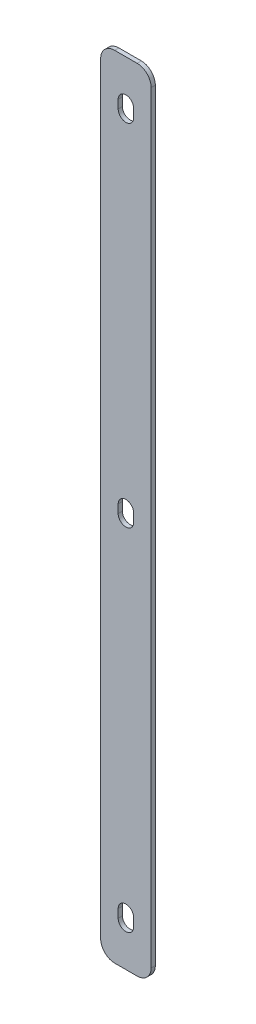
ISO-10303-21;
HEADER;
FILE_DESCRIPTION(('STEP AP214'),'2;1');
FILE_NAME('part.step','',(''),(''),'','','');
FILE_SCHEMA(('AUTOMOTIVE_DESIGN { 1 0 10303 214 1 1 1 1 }'));
ENDSEC;
DATA;
#1=APPLICATION_CONTEXT('core data for automotive mechanical design processes');
#2=APPLICATION_PROTOCOL_DEFINITION('international standard','automotive_design',2000,#1);
#3=PRODUCT_CONTEXT('',#1,'mechanical');
#4=PRODUCT('Part','Part','',(#3));
#5=PRODUCT_RELATED_PRODUCT_CATEGORY('part','',(#4));
#6=PRODUCT_DEFINITION_FORMATION('','',#4);
#7=PRODUCT_DEFINITION_CONTEXT('part definition',#1,'design');
#8=PRODUCT_DEFINITION('design','',#6,#7);
#9=PRODUCT_DEFINITION_SHAPE('','',#8);
#10=(LENGTH_UNIT() NAMED_UNIT(*) SI_UNIT(.MILLI.,.METRE.));
#11=(NAMED_UNIT(*) PLANE_ANGLE_UNIT() SI_UNIT($,.RADIAN.));
#12=(NAMED_UNIT(*) SI_UNIT($,.STERADIAN.) SOLID_ANGLE_UNIT());
#13=UNCERTAINTY_MEASURE_WITH_UNIT(LENGTH_MEASURE(1.E-05),#10,'distance_accuracy_value','');
#14=(GEOMETRIC_REPRESENTATION_CONTEXT(3) GLOBAL_UNCERTAINTY_ASSIGNED_CONTEXT((#13)) GLOBAL_UNIT_ASSIGNED_CONTEXT((#10,
#11,#12)) REPRESENTATION_CONTEXT('',''));
#15=CARTESIAN_POINT('',(0.,0.,0.));
#16=DIRECTION('',(0.,0.,1.));
#17=DIRECTION('',(1.,0.,0.));
#18=AXIS2_PLACEMENT_3D('',#15,#16,#17);
#19=CARTESIAN_POINT('',(0.,0.,-1.5));
#20=DIRECTION('',(0.,0.,1.));
#21=DIRECTION('',(1.,0.,0.));
#22=AXIS2_PLACEMENT_3D('',#19,#20,#21);
#23=PLANE('',#22);
#24=DIRECTION('',(0.,1.,0.));
#25=VECTOR('',#24,1.);
#26=CARTESIAN_POINT('',(2.75,-126.5,-1.5));
#27=LINE('',#26,#25);
#28=CARTESIAN_POINT('',(2.75,-126.5,-1.5));
#29=VERTEX_POINT('',#28);
#30=CARTESIAN_POINT('',(2.75,-123.5,-1.5));
#31=VERTEX_POINT('',#30);
#32=EDGE_CURVE('E184',#29,#31,#27,.T.);
#33=ORIENTED_EDGE('',*,*,#32,.T.);
#34=CARTESIAN_POINT('',(0.,-123.5,-1.5));
#35=DIRECTION('',(0.,0.,1.));
#36=DIRECTION('',(1.,0.,0.));
#37=AXIS2_PLACEMENT_3D('',#34,#35,#36);
#38=CIRCLE('',#37,2.75);
#39=CARTESIAN_POINT('',(-2.75,-123.5,-1.5));
#40=VERTEX_POINT('',#39);
#41=EDGE_CURVE('E187',#31,#40,#38,.T.);
#42=ORIENTED_EDGE('',*,*,#41,.T.);
#43=DIRECTION('',(0.,1.,0.));
#44=VECTOR('',#43,1.);
#45=CARTESIAN_POINT('',(-2.75,-126.5,-1.5));
#46=LINE('',#45,#44);
#47=CARTESIAN_POINT('',(-2.75,-126.5,-1.5));
#48=VERTEX_POINT('',#47);
#49=EDGE_CURVE('E181',#40,#48,#46,.F.);
#50=ORIENTED_EDGE('',*,*,#49,.T.);
#51=CARTESIAN_POINT('',(0.,-126.5,-1.5));
#52=DIRECTION('',(0.,0.,1.));
#53=DIRECTION('',(1.,0.,0.));
#54=AXIS2_PLACEMENT_3D('',#51,#52,#53);
#55=CIRCLE('',#54,2.75);
#56=EDGE_CURVE('E248',#48,#29,#55,.T.);
#57=ORIENTED_EDGE('',*,*,#56,.T.);
#58=EDGE_LOOP('',(#33,#42,#50,#57));
#59=FACE_BOUND('',#58,.T.);
#60=DIRECTION('',(0.,-1.,0.));
#61=VECTOR('',#60,1.);
#62=CARTESIAN_POINT('',(-2.74999999999738,126.5,-1.5));
#63=LINE('',#62,#61);
#64=CARTESIAN_POINT('',(-2.74999999999738,126.5,-1.5));
#65=VERTEX_POINT('',#64);
#66=CARTESIAN_POINT('',(-2.74999999999738,123.5,-1.5));
#67=VERTEX_POINT('',#66);
#68=EDGE_CURVE('E192',#65,#67,#63,.T.);
#69=ORIENTED_EDGE('',*,*,#68,.T.);
#70=CARTESIAN_POINT('',(2.6201161134431E-12,123.5,-1.5));
#71=DIRECTION('',(0.,0.,1.));
#72=DIRECTION('',(1.,0.,0.));
#73=AXIS2_PLACEMENT_3D('',#70,#71,#72);
#74=CIRCLE('',#73,2.75);
#75=CARTESIAN_POINT('',(2.75000000000262,123.5,-1.5));
#76=VERTEX_POINT('',#75);
#77=EDGE_CURVE('E195',#67,#76,#74,.T.);
#78=ORIENTED_EDGE('',*,*,#77,.T.);
#79=DIRECTION('',(0.,1.,0.));
#80=VECTOR('',#79,1.);
#81=CARTESIAN_POINT('',(2.75000000000262,126.5,-1.5));
#82=LINE('',#81,#80);
#83=CARTESIAN_POINT('',(2.75000000000262,126.5,-1.5));
#84=VERTEX_POINT('',#83);
#85=EDGE_CURVE('E188',#76,#84,#82,.T.);
#86=ORIENTED_EDGE('',*,*,#85,.T.);
#87=CARTESIAN_POINT('',(2.61993241642322E-12,126.5,-1.5));
#88=DIRECTION('',(0.,0.,1.));
#89=DIRECTION('',(1.,0.,0.));
#90=AXIS2_PLACEMENT_3D('',#87,#88,#89);
#91=CIRCLE('',#90,2.75);
#92=EDGE_CURVE('E252',#84,#65,#91,.T.);
#93=ORIENTED_EDGE('',*,*,#92,.T.);
#94=EDGE_LOOP('',(#69,#78,#86,#93));
#95=FACE_BOUND('',#94,.T.);
#96=DIRECTION('',(0.,-1.,0.));
#97=VECTOR('',#96,1.);
#98=CARTESIAN_POINT('',(-2.75,1.49999999999997,-1.5));
#99=LINE('',#98,#97);
#100=CARTESIAN_POINT('',(-2.75,1.49999999999997,-1.5));
#101=VERTEX_POINT('',#100);
#102=CARTESIAN_POINT('',(-2.75,-1.49999999999997,-1.5));
#103=VERTEX_POINT('',#102);
#104=EDGE_CURVE('E200',#101,#103,#99,.T.);
#105=ORIENTED_EDGE('',*,*,#104,.T.);
#106=CARTESIAN_POINT('',(0.,-1.49999999999997,-1.5));
#107=DIRECTION('',(0.,0.,1.));
#108=DIRECTION('',(1.,0.,0.));
#109=AXIS2_PLACEMENT_3D('',#106,#107,#108);
#110=CIRCLE('',#109,2.75);
#111=CARTESIAN_POINT('',(2.75,-1.49999999999997,-1.5));
#112=VERTEX_POINT('',#111);
#113=EDGE_CURVE('E203',#103,#112,#110,.T.);
#114=ORIENTED_EDGE('',*,*,#113,.T.);
#115=DIRECTION('',(0.,1.,0.));
#116=VECTOR('',#115,1.);
#117=CARTESIAN_POINT('',(2.75,1.49999999999997,-1.5));
#118=LINE('',#117,#116);
#119=CARTESIAN_POINT('',(2.75,1.49999999999997,-1.5));
#120=VERTEX_POINT('',#119);
#121=EDGE_CURVE('E196',#112,#120,#118,.T.);
#122=ORIENTED_EDGE('',*,*,#121,.T.);
#123=CARTESIAN_POINT('',(0.,1.49999999999997,-1.5));
#124=DIRECTION('',(0.,0.,1.));
#125=DIRECTION('',(1.,0.,0.));
#126=AXIS2_PLACEMENT_3D('',#123,#124,#125);
#127=CIRCLE('',#126,2.75);
#128=EDGE_CURVE('E256',#120,#101,#127,.T.);
#129=ORIENTED_EDGE('',*,*,#128,.T.);
#130=EDGE_LOOP('',(#105,#114,#122,#129));
#131=FACE_BOUND('',#130,.T.);
#132=DIRECTION('',(1.,0.,0.));
#133=VECTOR('',#132,1.);
#134=CARTESIAN_POINT('',(-8.99999999999998,-141.,-1.5));
#135=LINE('',#134,#133);
#136=CARTESIAN_POINT('',(-3.99999999999998,-141.,-1.5));
#137=VERTEX_POINT('',#136);
#138=CARTESIAN_POINT('',(4.00000000000002,-141.,-1.5));
#139=VERTEX_POINT('',#138);
#140=EDGE_CURVE('E165',#137,#139,#135,.T.);
#141=ORIENTED_EDGE('',*,*,#140,.F.);
#142=CARTESIAN_POINT('',(-3.99999999999998,-136.,-1.5));
#143=DIRECTION('',(0.,0.,1.));
#144=DIRECTION('',(1.,0.,0.));
#145=AXIS2_PLACEMENT_3D('',#142,#143,#144);
#146=CIRCLE('',#145,5.);
#147=CARTESIAN_POINT('',(-8.99999999999998,-136.,-1.5));
#148=VERTEX_POINT('',#147);
#149=EDGE_CURVE('E20',#148,#137,#146,.T.);
#150=ORIENTED_EDGE('',*,*,#149,.F.);
#151=DIRECTION('',(0.,-1.,0.));
#152=VECTOR('',#151,1.);
#153=CARTESIAN_POINT('',(-9.00000000000001,141.,-1.5));
#154=LINE('',#153,#152);
#155=CARTESIAN_POINT('',(-9.00000000000001,136.,-1.5));
#156=VERTEX_POINT('',#155);
#157=EDGE_CURVE('E151',#156,#148,#154,.T.);
#158=ORIENTED_EDGE('',*,*,#157,.F.);
#159=CARTESIAN_POINT('',(-4.00000000000001,136.,-1.5));
#160=DIRECTION('',(0.,0.,1.));
#161=DIRECTION('',(1.,0.,0.));
#162=AXIS2_PLACEMENT_3D('',#159,#160,#161);
#163=CIRCLE('',#162,5.);
#164=CARTESIAN_POINT('',(-4.00000000000001,141.,-1.5));
#165=VERTEX_POINT('',#164);
#166=EDGE_CURVE('E261',#165,#156,#163,.T.);
#167=ORIENTED_EDGE('',*,*,#166,.F.);
#168=DIRECTION('',(1.,0.,0.));
#169=VECTOR('',#168,1.);
#170=CARTESIAN_POINT('',(-9.00000000000001,141.,-1.5));
#171=LINE('',#170,#169);
#172=CARTESIAN_POINT('',(3.99999999999998,141.,-1.5));
#173=VERTEX_POINT('',#172);
#174=EDGE_CURVE('E205',#173,#165,#171,.F.);
#175=ORIENTED_EDGE('',*,*,#174,.F.);
#176=CARTESIAN_POINT('',(3.99999999999998,136.,-1.5));
#177=DIRECTION('',(0.,0.,1.));
#178=DIRECTION('',(1.,0.,0.));
#179=AXIS2_PLACEMENT_3D('',#176,#177,#178);
#180=CIRCLE('',#179,5.);
#181=CARTESIAN_POINT('',(8.99999999999998,136.,-1.5));
#182=VERTEX_POINT('',#181);
#183=EDGE_CURVE('E264',#182,#173,#180,.T.);
#184=ORIENTED_EDGE('',*,*,#183,.F.);
#185=DIRECTION('',(0.,1.,0.));
#186=VECTOR('',#185,1.);
#187=CARTESIAN_POINT('',(8.99999999999998,141.,-1.5));
#188=LINE('',#187,#186);
#189=CARTESIAN_POINT('',(9.00000000000002,-136.,-1.5));
#190=VERTEX_POINT('',#189);
#191=EDGE_CURVE('E209',#190,#182,#188,.T.);
#192=ORIENTED_EDGE('',*,*,#191,.F.);
#193=CARTESIAN_POINT('',(4.00000000000002,-136.,-1.5));
#194=DIRECTION('',(0.,0.,1.));
#195=DIRECTION('',(1.,0.,0.));
#196=AXIS2_PLACEMENT_3D('',#193,#194,#195);
#197=CIRCLE('',#196,5.);
#198=EDGE_CURVE('E167',#139,#190,#197,.T.);
#199=ORIENTED_EDGE('',*,*,#198,.F.);
#200=EDGE_LOOP('',(#141,#150,#158,#167,#175,#184,#192,#199));
#201=FACE_BOUND('',#200,.T.);
#202=ADVANCED_FACE('F17',(#59,#95,#131,#201),#23,.F.);
#203=CARTESIAN_POINT('',(-9.00000000000001,141.,-1.5));
#204=DIRECTION('',(-1.,0.,0.));
#205=DIRECTION('',(0.,-1.,0.));
#206=AXIS2_PLACEMENT_3D('',#203,#204,#205);
#207=PLANE('',#206);
#208=ORIENTED_EDGE('',*,*,#157,.T.);
#209=DIRECTION('',(0.,0.,1.));
#210=VECTOR('',#209,1.);
#211=CARTESIAN_POINT('',(-8.99999999999998,-136.,-1.5));
#212=LINE('',#211,#210);
#213=CARTESIAN_POINT('',(-9.,-136.,0.));
#214=VERTEX_POINT('',#213);
#215=EDGE_CURVE('E162',#214,#148,#212,.F.);
#216=ORIENTED_EDGE('',*,*,#215,.F.);
#217=DIRECTION('',(0.,1.,0.));
#218=VECTOR('',#217,1.);
#219=CARTESIAN_POINT('',(-9.00000000000001,0.,0.));
#220=LINE('',#219,#218);
#221=CARTESIAN_POINT('',(-9.00000000000001,136.,0.));
#222=VERTEX_POINT('',#221);
#223=EDGE_CURVE('E247',#222,#214,#220,.F.);
#224=ORIENTED_EDGE('',*,*,#223,.F.);
#225=DIRECTION('',(0.,0.,1.));
#226=VECTOR('',#225,1.);
#227=CARTESIAN_POINT('',(-9.00000000000001,136.,-1.5));
#228=LINE('',#227,#226);
#229=EDGE_CURVE('E260',#156,#222,#228,.T.);
#230=ORIENTED_EDGE('',*,*,#229,.F.);
#231=EDGE_LOOP('',(#208,#216,#224,#230));
#232=FACE_BOUND('',#231,.T.);
#233=ADVANCED_FACE('F516',(#232),#207,.T.);
#234=CARTESIAN_POINT('',(-3.99999999999998,-136.,-1.5));
#235=DIRECTION('',(0.,0.,1.));
#236=DIRECTION('',(1.,0.,0.));
#237=AXIS2_PLACEMENT_3D('',#234,#235,#236);
#238=CYLINDRICAL_SURFACE('',#237,5.);
#239=ORIENTED_EDGE('',*,*,#149,.T.);
#240=DIRECTION('',(0.,0.,-1.));
#241=VECTOR('',#240,1.);
#242=CARTESIAN_POINT('',(-3.99999999999998,-141.,-1.5));
#243=LINE('',#242,#241);
#244=CARTESIAN_POINT('',(-3.99999999999998,-141.,0.));
#245=VERTEX_POINT('',#244);
#246=EDGE_CURVE('E160',#245,#137,#243,.T.);
#247=ORIENTED_EDGE('',*,*,#246,.F.);
#248=CARTESIAN_POINT('',(-3.99999999999998,-136.,0.));
#249=DIRECTION('',(0.,0.,1.));
#250=DIRECTION('',(1.,0.,0.));
#251=AXIS2_PLACEMENT_3D('',#248,#249,#250);
#252=CIRCLE('',#251,5.);
#253=EDGE_CURVE('E245',#214,#245,#252,.T.);
#254=ORIENTED_EDGE('',*,*,#253,.F.);
#255=ORIENTED_EDGE('',*,*,#215,.T.);
#256=EDGE_LOOP('',(#239,#247,#254,#255));
#257=FACE_BOUND('',#256,.T.);
#258=ADVANCED_FACE('F157',(#257),#238,.T.);
#259=CARTESIAN_POINT('',(-8.99999999999998,-141.,-1.5));
#260=DIRECTION('',(0.,-1.,0.));
#261=DIRECTION('',(0.,0.,-1.));
#262=AXIS2_PLACEMENT_3D('',#259,#260,#261);
#263=PLANE('',#262);
#264=ORIENTED_EDGE('',*,*,#140,.T.);
#265=DIRECTION('',(0.,0.,1.));
#266=VECTOR('',#265,1.);
#267=CARTESIAN_POINT('',(4.00000000000002,-141.,-1.5));
#268=LINE('',#267,#266);
#269=CARTESIAN_POINT('',(4.00000000000002,-141.,0.));
#270=VERTEX_POINT('',#269);
#271=EDGE_CURVE('E170',#270,#139,#268,.F.);
#272=ORIENTED_EDGE('',*,*,#271,.F.);
#273=DIRECTION('',(1.,0.,0.));
#274=VECTOR('',#273,1.);
#275=CARTESIAN_POINT('',(0.,-141.,0.));
#276=LINE('',#275,#274);
#277=EDGE_CURVE('E174',#245,#270,#276,.T.);
#278=ORIENTED_EDGE('',*,*,#277,.F.);
#279=ORIENTED_EDGE('',*,*,#246,.T.);
#280=EDGE_LOOP('',(#264,#272,#278,#279));
#281=FACE_BOUND('',#280,.T.);
#282=ADVANCED_FACE('F172',(#281),#263,.T.);
#283=CARTESIAN_POINT('',(4.00000000000002,-136.,-1.5));
#284=DIRECTION('',(0.,0.,1.));
#285=DIRECTION('',(1.,0.,0.));
#286=AXIS2_PLACEMENT_3D('',#283,#284,#285);
#287=CYLINDRICAL_SURFACE('',#286,5.);
#288=ORIENTED_EDGE('',*,*,#198,.T.);
#289=DIRECTION('',(0.,0.,1.));
#290=VECTOR('',#289,1.);
#291=CARTESIAN_POINT('',(9.00000000000002,-136.,-1.5));
#292=LINE('',#291,#290);
#293=CARTESIAN_POINT('',(9.00000000000002,-136.,0.));
#294=VERTEX_POINT('',#293);
#295=EDGE_CURVE('E210',#294,#190,#292,.F.);
#296=ORIENTED_EDGE('',*,*,#295,.F.);
#297=CARTESIAN_POINT('',(4.00000000000002,-136.,0.));
#298=DIRECTION('',(0.,0.,1.));
#299=DIRECTION('',(1.,0.,0.));
#300=AXIS2_PLACEMENT_3D('',#297,#298,#299);
#301=CIRCLE('',#300,5.);
#302=EDGE_CURVE('E242',#270,#294,#301,.T.);
#303=ORIENTED_EDGE('',*,*,#302,.F.);
#304=ORIENTED_EDGE('',*,*,#271,.T.);
#305=EDGE_LOOP('',(#288,#296,#303,#304));
#306=FACE_BOUND('',#305,.T.);
#307=ADVANCED_FACE('F269',(#306),#287,.T.);
#308=CARTESIAN_POINT('',(8.99999999999998,141.,-1.5));
#309=DIRECTION('',(1.,0.,0.));
#310=DIRECTION('',(0.,1.,0.));
#311=AXIS2_PLACEMENT_3D('',#308,#309,#310);
#312=PLANE('',#311);
#313=DIRECTION('',(0.,1.,0.));
#314=VECTOR('',#313,1.);
#315=CARTESIAN_POINT('',(9.00000000000002,0.,0.));
#316=LINE('',#315,#314);
#317=CARTESIAN_POINT('',(9.,136.,0.));
#318=VERTEX_POINT('',#317);
#319=EDGE_CURVE('E241',#294,#318,#316,.T.);
#320=ORIENTED_EDGE('',*,*,#319,.F.);
#321=ORIENTED_EDGE('',*,*,#295,.T.);
#322=ORIENTED_EDGE('',*,*,#191,.T.);
#323=DIRECTION('',(0.,0.,1.));
#324=VECTOR('',#323,1.);
#325=CARTESIAN_POINT('',(8.99999999999998,136.,-1.5));
#326=LINE('',#325,#324);
#327=EDGE_CURVE('E265',#318,#182,#326,.F.);
#328=ORIENTED_EDGE('',*,*,#327,.F.);
#329=EDGE_LOOP('',(#320,#321,#322,#328));
#330=FACE_BOUND('',#329,.T.);
#331=ADVANCED_FACE('F304',(#330),#312,.T.);
#332=CARTESIAN_POINT('',(3.99999999999998,136.,-1.5));
#333=DIRECTION('',(0.,0.,1.));
#334=DIRECTION('',(1.,0.,0.));
#335=AXIS2_PLACEMENT_3D('',#332,#333,#334);
#336=CYLINDRICAL_SURFACE('',#335,5.);
#337=ORIENTED_EDGE('',*,*,#183,.T.);
#338=DIRECTION('',(0.,0.,1.));
#339=VECTOR('',#338,1.);
#340=CARTESIAN_POINT('',(3.99999999999998,141.,-1.5));
#341=LINE('',#340,#339);
#342=CARTESIAN_POINT('',(3.99999999999998,141.,0.));
#343=VERTEX_POINT('',#342);
#344=EDGE_CURVE('E208',#343,#173,#341,.F.);
#345=ORIENTED_EDGE('',*,*,#344,.F.);
#346=CARTESIAN_POINT('',(3.99999999999998,136.,0.));
#347=DIRECTION('',(0.,0.,1.));
#348=DIRECTION('',(1.,0.,0.));
#349=AXIS2_PLACEMENT_3D('',#346,#347,#348);
#350=CIRCLE('',#349,5.);
#351=EDGE_CURVE('E238',#318,#343,#350,.T.);
#352=ORIENTED_EDGE('',*,*,#351,.F.);
#353=ORIENTED_EDGE('',*,*,#327,.T.);
#354=EDGE_LOOP('',(#337,#345,#352,#353));
#355=FACE_BOUND('',#354,.T.);
#356=ADVANCED_FACE('F309',(#355),#336,.T.);
#357=CARTESIAN_POINT('',(-9.00000000000001,141.,-1.5));
#358=DIRECTION('',(0.,1.,0.));
#359=DIRECTION('',(0.,0.,1.));
#360=AXIS2_PLACEMENT_3D('',#357,#358,#359);
#361=PLANE('',#360);
#362=ORIENTED_EDGE('',*,*,#174,.T.);
#363=DIRECTION('',(0.,0.,1.));
#364=VECTOR('',#363,1.);
#365=CARTESIAN_POINT('',(-4.00000000000001,141.,-1.5));
#366=LINE('',#365,#364);
#367=CARTESIAN_POINT('',(-4.00000000000001,141.,0.));
#368=VERTEX_POINT('',#367);
#369=EDGE_CURVE('E207',#368,#165,#366,.F.);
#370=ORIENTED_EDGE('',*,*,#369,.F.);
#371=DIRECTION('',(1.,0.,0.));
#372=VECTOR('',#371,1.);
#373=CARTESIAN_POINT('',(0.,141.,0.));
#374=LINE('',#373,#372);
#375=EDGE_CURVE('E237',#343,#368,#374,.F.);
#376=ORIENTED_EDGE('',*,*,#375,.F.);
#377=ORIENTED_EDGE('',*,*,#344,.T.);
#378=EDGE_LOOP('',(#362,#370,#376,#377));
#379=FACE_BOUND('',#378,.T.);
#380=ADVANCED_FACE('F312',(#379),#361,.T.);
#381=CARTESIAN_POINT('',(-4.00000000000001,136.,-1.5));
#382=DIRECTION('',(0.,0.,1.));
#383=DIRECTION('',(1.,0.,0.));
#384=AXIS2_PLACEMENT_3D('',#381,#382,#383);
#385=CYLINDRICAL_SURFACE('',#384,5.);
#386=ORIENTED_EDGE('',*,*,#166,.T.);
#387=ORIENTED_EDGE('',*,*,#229,.T.);
#388=CARTESIAN_POINT('',(-4.00000000000001,136.,0.));
#389=DIRECTION('',(0.,0.,1.));
#390=DIRECTION('',(1.,0.,0.));
#391=AXIS2_PLACEMENT_3D('',#388,#389,#390);
#392=CIRCLE('',#391,5.);
#393=EDGE_CURVE('E234',#368,#222,#392,.T.);
#394=ORIENTED_EDGE('',*,*,#393,.F.);
#395=ORIENTED_EDGE('',*,*,#369,.T.);
#396=EDGE_LOOP('',(#386,#387,#394,#395));
#397=FACE_BOUND('',#396,.T.);
#398=ADVANCED_FACE('F457',(#397),#385,.T.);
#399=CARTESIAN_POINT('',(0.,-1.49999999999997,-10.));
#400=DIRECTION('',(0.,0.,1.));
#401=DIRECTION('',(1.,0.,0.));
#402=AXIS2_PLACEMENT_3D('',#399,#400,#401);
#403=CYLINDRICAL_SURFACE('',#402,2.75);
#404=DIRECTION('',(0.,0.,1.));
#405=VECTOR('',#404,1.);
#406=CARTESIAN_POINT('',(2.75,-1.49999999999997,-10.));
#407=LINE('',#406,#405);
#408=CARTESIAN_POINT('',(2.75,-1.49999999999997,0.));
#409=VERTEX_POINT('',#408);
#410=EDGE_CURVE('E199',#409,#112,#407,.F.);
#411=ORIENTED_EDGE('',*,*,#410,.T.);
#412=ORIENTED_EDGE('',*,*,#113,.F.);
#413=DIRECTION('',(0.,0.,1.));
#414=VECTOR('',#413,1.);
#415=CARTESIAN_POINT('',(-2.75,-1.49999999999997,-10.));
#416=LINE('',#415,#414);
#417=CARTESIAN_POINT('',(-2.75,-1.49999999999997,0.));
#418=VERTEX_POINT('',#417);
#419=EDGE_CURVE('E202',#103,#418,#416,.T.);
#420=ORIENTED_EDGE('',*,*,#419,.T.);
#421=CARTESIAN_POINT('',(0.,-1.49999999999997,0.));
#422=DIRECTION('',(0.,0.,1.));
#423=DIRECTION('',(1.,0.,0.));
#424=AXIS2_PLACEMENT_3D('',#421,#422,#423);
#425=CIRCLE('',#424,2.75);
#426=EDGE_CURVE('E231',#409,#418,#425,.F.);
#427=ORIENTED_EDGE('',*,*,#426,.F.);
#428=EDGE_LOOP('',(#411,#412,#420,#427));
#429=FACE_BOUND('',#428,.T.);
#430=ADVANCED_FACE('F447',(#429),#403,.F.);
#431=CARTESIAN_POINT('',(-2.75,1.49999999999997,-10.));
#432=DIRECTION('',(-1.,0.,0.));
#433=DIRECTION('',(0.,-1.,0.));
#434=AXIS2_PLACEMENT_3D('',#431,#432,#433);
#435=PLANE('',#434);
#436=ORIENTED_EDGE('',*,*,#419,.F.);
#437=ORIENTED_EDGE('',*,*,#104,.F.);
#438=DIRECTION('',(0.,0.,1.));
#439=VECTOR('',#438,1.);
#440=CARTESIAN_POINT('',(-2.75,1.49999999999997,-10.));
#441=LINE('',#440,#439);
#442=CARTESIAN_POINT('',(-2.75,1.49999999999997,0.));
#443=VERTEX_POINT('',#442);
#444=EDGE_CURVE('E258',#101,#443,#441,.T.);
#445=ORIENTED_EDGE('',*,*,#444,.T.);
#446=DIRECTION('',(0.,1.,0.));
#447=VECTOR('',#446,1.);
#448=CARTESIAN_POINT('',(-2.75,0.,0.));
#449=LINE('',#448,#447);
#450=EDGE_CURVE('E230',#418,#443,#449,.T.);
#451=ORIENTED_EDGE('',*,*,#450,.F.);
#452=EDGE_LOOP('',(#436,#437,#445,#451));
#453=FACE_BOUND('',#452,.T.);
#454=ADVANCED_FACE('F437',(#453),#435,.F.);
#455=CARTESIAN_POINT('',(0.,1.49999999999997,-10.));
#456=DIRECTION('',(0.,0.,1.));
#457=DIRECTION('',(1.,0.,0.));
#458=AXIS2_PLACEMENT_3D('',#455,#456,#457);
#459=CYLINDRICAL_SURFACE('',#458,2.75);
#460=ORIENTED_EDGE('',*,*,#444,.F.);
#461=ORIENTED_EDGE('',*,*,#128,.F.);
#462=DIRECTION('',(0.,0.,1.));
#463=VECTOR('',#462,1.);
#464=CARTESIAN_POINT('',(2.75,1.49999999999997,-10.));
#465=LINE('',#464,#463);
#466=CARTESIAN_POINT('',(2.75,1.49999999999997,0.));
#467=VERTEX_POINT('',#466);
#468=EDGE_CURVE('E198',#120,#467,#465,.T.);
#469=ORIENTED_EDGE('',*,*,#468,.T.);
#470=CARTESIAN_POINT('',(0.,1.49999999999997,0.));
#471=DIRECTION('',(0.,0.,1.));
#472=DIRECTION('',(1.,0.,0.));
#473=AXIS2_PLACEMENT_3D('',#470,#471,#472);
#474=CIRCLE('',#473,2.75);
#475=EDGE_CURVE('E227',#443,#467,#474,.F.);
#476=ORIENTED_EDGE('',*,*,#475,.F.);
#477=EDGE_LOOP('',(#460,#461,#469,#476));
#478=FACE_BOUND('',#477,.T.);
#479=ADVANCED_FACE('F427',(#478),#459,.F.);
#480=CARTESIAN_POINT('',(2.75,1.49999999999997,-10.));
#481=DIRECTION('',(1.,0.,0.));
#482=DIRECTION('',(0.,1.,0.));
#483=AXIS2_PLACEMENT_3D('',#480,#481,#482);
#484=PLANE('',#483);
#485=ORIENTED_EDGE('',*,*,#468,.F.);
#486=ORIENTED_EDGE('',*,*,#121,.F.);
#487=ORIENTED_EDGE('',*,*,#410,.F.);
#488=DIRECTION('',(0.,1.,0.));
#489=VECTOR('',#488,1.);
#490=CARTESIAN_POINT('',(2.75,0.,0.));
#491=LINE('',#490,#489);
#492=EDGE_CURVE('E226',#467,#409,#491,.F.);
#493=ORIENTED_EDGE('',*,*,#492,.F.);
#494=EDGE_LOOP('',(#485,#486,#487,#493));
#495=FACE_BOUND('',#494,.T.);
#496=ADVANCED_FACE('F417',(#495),#484,.F.);
#497=CARTESIAN_POINT('',(2.6201161134431E-12,123.5,-10.));
#498=DIRECTION('',(0.,0.,1.));
#499=DIRECTION('',(1.,0.,0.));
#500=AXIS2_PLACEMENT_3D('',#497,#498,#499);
#501=CYLINDRICAL_SURFACE('',#500,2.75);
#502=DIRECTION('',(0.,0.,-1.));
#503=VECTOR('',#502,1.);
#504=CARTESIAN_POINT('',(2.75000000000262,123.5,-10.));
#505=LINE('',#504,#503);
#506=CARTESIAN_POINT('',(2.75000000000262,123.5,0.));
#507=VERTEX_POINT('',#506);
#508=EDGE_CURVE('E191',#507,#76,#505,.T.);
#509=ORIENTED_EDGE('',*,*,#508,.T.);
#510=ORIENTED_EDGE('',*,*,#77,.F.);
#511=DIRECTION('',(0.,0.,1.));
#512=VECTOR('',#511,1.);
#513=CARTESIAN_POINT('',(-2.74999999999738,123.5,-10.));
#514=LINE('',#513,#512);
#515=CARTESIAN_POINT('',(-2.74999999999738,123.5,0.));
#516=VERTEX_POINT('',#515);
#517=EDGE_CURVE('E194',#67,#516,#514,.T.);
#518=ORIENTED_EDGE('',*,*,#517,.T.);
#519=CARTESIAN_POINT('',(2.6201161134431E-12,123.5,0.));
#520=DIRECTION('',(0.,0.,1.));
#521=DIRECTION('',(1.,0.,0.));
#522=AXIS2_PLACEMENT_3D('',#519,#520,#521);
#523=CIRCLE('',#522,2.75);
#524=EDGE_CURVE('E223',#507,#516,#523,.F.);
#525=ORIENTED_EDGE('',*,*,#524,.F.);
#526=EDGE_LOOP('',(#509,#510,#518,#525));
#527=FACE_BOUND('',#526,.T.);
#528=ADVANCED_FACE('F407',(#527),#501,.F.);
#529=CARTESIAN_POINT('',(-2.74999999999738,126.5,-10.));
#530=DIRECTION('',(-1.,0.,0.));
#531=DIRECTION('',(0.,-1.,0.));
#532=AXIS2_PLACEMENT_3D('',#529,#530,#531);
#533=PLANE('',#532);
#534=ORIENTED_EDGE('',*,*,#517,.F.);
#535=ORIENTED_EDGE('',*,*,#68,.F.);
#536=DIRECTION('',(0.,0.,1.));
#537=VECTOR('',#536,1.);
#538=CARTESIAN_POINT('',(-2.74999999999738,126.5,-10.));
#539=LINE('',#538,#537);
#540=CARTESIAN_POINT('',(-2.74999999999738,126.5,0.));
#541=VERTEX_POINT('',#540);
#542=EDGE_CURVE('E254',#65,#541,#539,.T.);
#543=ORIENTED_EDGE('',*,*,#542,.T.);
#544=DIRECTION('',(0.,1.,0.));
#545=VECTOR('',#544,1.);
#546=CARTESIAN_POINT('',(-2.74999999999738,0.,0.));
#547=LINE('',#546,#545);
#548=EDGE_CURVE('E222',#516,#541,#547,.T.);
#549=ORIENTED_EDGE('',*,*,#548,.F.);
#550=EDGE_LOOP('',(#534,#535,#543,#549));
#551=FACE_BOUND('',#550,.T.);
#552=ADVANCED_FACE('F397',(#551),#533,.F.);
#553=CARTESIAN_POINT('',(2.61993241642322E-12,126.5,-10.));
#554=DIRECTION('',(0.,0.,1.));
#555=DIRECTION('',(1.,0.,0.));
#556=AXIS2_PLACEMENT_3D('',#553,#554,#555);
#557=CYLINDRICAL_SURFACE('',#556,2.75);
#558=ORIENTED_EDGE('',*,*,#542,.F.);
#559=ORIENTED_EDGE('',*,*,#92,.F.);
#560=DIRECTION('',(0.,0.,-1.));
#561=VECTOR('',#560,1.);
#562=CARTESIAN_POINT('',(2.75000000000262,126.5,-10.));
#563=LINE('',#562,#561);
#564=CARTESIAN_POINT('',(2.75000000000262,126.5,0.));
#565=VERTEX_POINT('',#564);
#566=EDGE_CURVE('E190',#84,#565,#563,.F.);
#567=ORIENTED_EDGE('',*,*,#566,.T.);
#568=CARTESIAN_POINT('',(2.61993241642322E-12,126.5,0.));
#569=DIRECTION('',(0.,0.,1.));
#570=DIRECTION('',(1.,0.,0.));
#571=AXIS2_PLACEMENT_3D('',#568,#569,#570);
#572=CIRCLE('',#571,2.75);
#573=EDGE_CURVE('E219',#541,#565,#572,.F.);
#574=ORIENTED_EDGE('',*,*,#573,.F.);
#575=EDGE_LOOP('',(#558,#559,#567,#574));
#576=FACE_BOUND('',#575,.T.);
#577=ADVANCED_FACE('F387',(#576),#557,.F.);
#578=CARTESIAN_POINT('',(2.75000000000262,126.5,-10.));
#579=DIRECTION('',(1.,0.,0.));
#580=DIRECTION('',(0.,0.,-1.));
#581=AXIS2_PLACEMENT_3D('',#578,#579,#580);
#582=PLANE('',#581);
#583=ORIENTED_EDGE('',*,*,#566,.F.);
#584=ORIENTED_EDGE('',*,*,#85,.F.);
#585=ORIENTED_EDGE('',*,*,#508,.F.);
#586=DIRECTION('',(0.,1.,0.));
#587=VECTOR('',#586,1.);
#588=CARTESIAN_POINT('',(2.75000000000262,0.,0.));
#589=LINE('',#588,#587);
#590=EDGE_CURVE('E218',#565,#507,#589,.F.);
#591=ORIENTED_EDGE('',*,*,#590,.F.);
#592=EDGE_LOOP('',(#583,#584,#585,#591));
#593=FACE_BOUND('',#592,.T.);
#594=ADVANCED_FACE('F377',(#593),#582,.F.);
#595=CARTESIAN_POINT('',(0.,-123.5,-10.));
#596=DIRECTION('',(0.,0.,1.));
#597=DIRECTION('',(1.,0.,0.));
#598=AXIS2_PLACEMENT_3D('',#595,#596,#597);
#599=CYLINDRICAL_SURFACE('',#598,2.75);
#600=DIRECTION('',(0.,0.,1.));
#601=VECTOR('',#600,1.);
#602=CARTESIAN_POINT('',(-2.75,-123.5,-10.));
#603=LINE('',#602,#601);
#604=CARTESIAN_POINT('',(-2.75,-123.5,0.));
#605=VERTEX_POINT('',#604);
#606=EDGE_CURVE('E183',#605,#40,#603,.F.);
#607=ORIENTED_EDGE('',*,*,#606,.T.);
#608=ORIENTED_EDGE('',*,*,#41,.F.);
#609=DIRECTION('',(0.,0.,-1.));
#610=VECTOR('',#609,1.);
#611=CARTESIAN_POINT('',(2.75,-123.5,-10.));
#612=LINE('',#611,#610);
#613=CARTESIAN_POINT('',(2.75,-123.5,0.));
#614=VERTEX_POINT('',#613);
#615=EDGE_CURVE('E186',#31,#614,#612,.F.);
#616=ORIENTED_EDGE('',*,*,#615,.T.);
#617=CARTESIAN_POINT('',(0.,-123.5,0.));
#618=DIRECTION('',(0.,0.,1.));
#619=DIRECTION('',(1.,0.,0.));
#620=AXIS2_PLACEMENT_3D('',#617,#618,#619);
#621=CIRCLE('',#620,2.75);
#622=EDGE_CURVE('E215',#605,#614,#621,.F.);
#623=ORIENTED_EDGE('',*,*,#622,.F.);
#624=EDGE_LOOP('',(#607,#608,#616,#623));
#625=FACE_BOUND('',#624,.T.);
#626=ADVANCED_FACE('F343',(#625),#599,.F.);
#627=CARTESIAN_POINT('',(2.75,-126.5,-10.));
#628=DIRECTION('',(1.,0.,0.));
#629=DIRECTION('',(0.,0.,-1.));
#630=AXIS2_PLACEMENT_3D('',#627,#628,#629);
#631=PLANE('',#630);
#632=ORIENTED_EDGE('',*,*,#615,.F.);
#633=ORIENTED_EDGE('',*,*,#32,.F.);
#634=DIRECTION('',(0.,0.,1.));
#635=VECTOR('',#634,1.);
#636=CARTESIAN_POINT('',(2.75,-126.5,-10.));
#637=LINE('',#636,#635);
#638=CARTESIAN_POINT('',(2.75,-126.5,0.));
#639=VERTEX_POINT('',#638);
#640=EDGE_CURVE('E250',#29,#639,#637,.T.);
#641=ORIENTED_EDGE('',*,*,#640,.T.);
#642=DIRECTION('',(0.,1.,0.));
#643=VECTOR('',#642,1.);
#644=CARTESIAN_POINT('',(2.75,0.,0.));
#645=LINE('',#644,#643);
#646=EDGE_CURVE('E214',#614,#639,#645,.F.);
#647=ORIENTED_EDGE('',*,*,#646,.F.);
#648=EDGE_LOOP('',(#632,#633,#641,#647));
#649=FACE_BOUND('',#648,.T.);
#650=ADVANCED_FACE('F329',(#649),#631,.F.);
#651=CARTESIAN_POINT('',(0.,-126.5,-10.));
#652=DIRECTION('',(0.,0.,1.));
#653=DIRECTION('',(1.,0.,0.));
#654=AXIS2_PLACEMENT_3D('',#651,#652,#653);
#655=CYLINDRICAL_SURFACE('',#654,2.75);
#656=ORIENTED_EDGE('',*,*,#640,.F.);
#657=ORIENTED_EDGE('',*,*,#56,.F.);
#658=DIRECTION('',(0.,0.,1.));
#659=VECTOR('',#658,1.);
#660=CARTESIAN_POINT('',(-2.75,-126.5,-10.));
#661=LINE('',#660,#659);
#662=CARTESIAN_POINT('',(-2.75,-126.5,0.));
#663=VERTEX_POINT('',#662);
#664=EDGE_CURVE('E35',#48,#663,#661,.T.);
#665=ORIENTED_EDGE('',*,*,#664,.T.);
#666=CARTESIAN_POINT('',(0.,-126.5,0.));
#667=DIRECTION('',(0.,0.,1.));
#668=DIRECTION('',(1.,0.,0.));
#669=AXIS2_PLACEMENT_3D('',#666,#667,#668);
#670=CIRCLE('',#669,2.75);
#671=EDGE_CURVE('E26',#639,#663,#670,.F.);
#672=ORIENTED_EDGE('',*,*,#671,.F.);
#673=EDGE_LOOP('',(#656,#657,#665,#672));
#674=FACE_BOUND('',#673,.T.);
#675=ADVANCED_FACE('F332',(#674),#655,.F.);
#676=CARTESIAN_POINT('',(-2.75,-126.5,-10.));
#677=DIRECTION('',(-1.,0.,0.));
#678=DIRECTION('',(0.,0.,1.));
#679=AXIS2_PLACEMENT_3D('',#676,#677,#678);
#680=PLANE('',#679);
#681=ORIENTED_EDGE('',*,*,#664,.F.);
#682=ORIENTED_EDGE('',*,*,#49,.F.);
#683=ORIENTED_EDGE('',*,*,#606,.F.);
#684=DIRECTION('',(0.,1.,0.));
#685=VECTOR('',#684,1.);
#686=CARTESIAN_POINT('',(-2.75,0.,0.));
#687=LINE('',#686,#685);
#688=EDGE_CURVE('E11',#663,#605,#687,.T.);
#689=ORIENTED_EDGE('',*,*,#688,.F.);
#690=EDGE_LOOP('',(#681,#682,#683,#689));
#691=FACE_BOUND('',#690,.T.);
#692=ADVANCED_FACE('F334',(#691),#680,.F.);
#693=CARTESIAN_POINT('',(0.,0.,0.));
#694=DIRECTION('',(0.,0.,1.));
#695=DIRECTION('',(1.,0.,0.));
#696=AXIS2_PLACEMENT_3D('',#693,#694,#695);
#697=PLANE('',#696);
#698=ORIENTED_EDGE('',*,*,#671,.T.);
#699=ORIENTED_EDGE('',*,*,#688,.T.);
#700=ORIENTED_EDGE('',*,*,#622,.T.);
#701=ORIENTED_EDGE('',*,*,#646,.T.);
#702=EDGE_LOOP('',(#698,#699,#700,#701));
#703=FACE_BOUND('',#702,.T.);
#704=ORIENTED_EDGE('',*,*,#573,.T.);
#705=ORIENTED_EDGE('',*,*,#590,.T.);
#706=ORIENTED_EDGE('',*,*,#524,.T.);
#707=ORIENTED_EDGE('',*,*,#548,.T.);
#708=EDGE_LOOP('',(#704,#705,#706,#707));
#709=FACE_BOUND('',#708,.T.);
#710=ORIENTED_EDGE('',*,*,#475,.T.);
#711=ORIENTED_EDGE('',*,*,#492,.T.);
#712=ORIENTED_EDGE('',*,*,#426,.T.);
#713=ORIENTED_EDGE('',*,*,#450,.T.);
#714=EDGE_LOOP('',(#710,#711,#712,#713));
#715=FACE_BOUND('',#714,.T.);
#716=ORIENTED_EDGE('',*,*,#375,.T.);
#717=ORIENTED_EDGE('',*,*,#393,.T.);
#718=ORIENTED_EDGE('',*,*,#223,.T.);
#719=ORIENTED_EDGE('',*,*,#253,.T.);
#720=ORIENTED_EDGE('',*,*,#277,.T.);
#721=ORIENTED_EDGE('',*,*,#302,.T.);
#722=ORIENTED_EDGE('',*,*,#319,.T.);
#723=ORIENTED_EDGE('',*,*,#351,.T.);
#724=EDGE_LOOP('',(#716,#717,#718,#719,#720,#721,#722,#723));
#725=FACE_BOUND('',#724,.T.);
#726=ADVANCED_FACE('F274',(#703,#709,#715,#725),#697,.T.);
#727=CLOSED_SHELL('',(#202,#233,#258,#282,#307,#331,#356,#380,#398,#430,#454,#479,#496,#528,
#552,#577,#594,#626,#650,#675,#692,#726));
#728=MANIFOLD_SOLID_BREP('B1',#727);
#729=ADVANCED_BREP_SHAPE_REPRESENTATION('',(#18,#728),#14);
#730=SHAPE_DEFINITION_REPRESENTATION(#9,#729);
ENDSEC;
END-ISO-10303-21;
